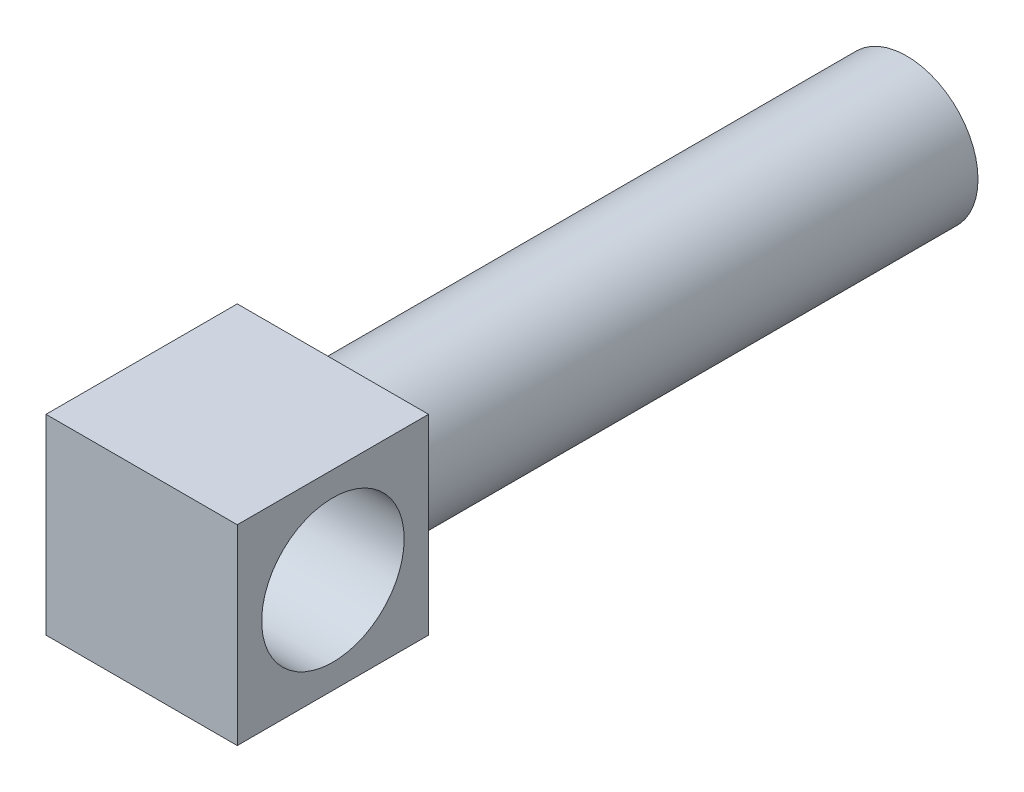
ISO-10303-21;
HEADER;
FILE_DESCRIPTION(('STEP AP214'),'2;1');
FILE_NAME('part.step','',(''),(''),'','','');
FILE_SCHEMA(('AUTOMOTIVE_DESIGN { 1 0 10303 214 1 1 1 1 }'));
ENDSEC;
DATA;
#1=APPLICATION_CONTEXT('core data for automotive mechanical design processes');
#2=APPLICATION_PROTOCOL_DEFINITION('international standard','automotive_design',2000,#1);
#3=PRODUCT_CONTEXT('',#1,'mechanical');
#4=PRODUCT('Part','Part','',(#3));
#5=PRODUCT_RELATED_PRODUCT_CATEGORY('part','',(#4));
#6=PRODUCT_DEFINITION_FORMATION('','',#4);
#7=PRODUCT_DEFINITION_CONTEXT('part definition',#1,'design');
#8=PRODUCT_DEFINITION('design','',#6,#7);
#9=PRODUCT_DEFINITION_SHAPE('','',#8);
#10=(LENGTH_UNIT() NAMED_UNIT(*) SI_UNIT(.MILLI.,.METRE.));
#11=(NAMED_UNIT(*) PLANE_ANGLE_UNIT() SI_UNIT($,.RADIAN.));
#12=(NAMED_UNIT(*) SI_UNIT($,.STERADIAN.) SOLID_ANGLE_UNIT());
#13=UNCERTAINTY_MEASURE_WITH_UNIT(LENGTH_MEASURE(1.E-05),#10,'distance_accuracy_value','');
#14=(GEOMETRIC_REPRESENTATION_CONTEXT(3) GLOBAL_UNCERTAINTY_ASSIGNED_CONTEXT((#13)) GLOBAL_UNIT_ASSIGNED_CONTEXT((#10,
#11,#12)) REPRESENTATION_CONTEXT('',''));
#15=CARTESIAN_POINT('',(0.,0.,0.));
#16=DIRECTION('',(0.,0.,1.));
#17=DIRECTION('',(1.,0.,0.));
#18=AXIS2_PLACEMENT_3D('',#15,#16,#17);
#19=CARTESIAN_POINT('',(18.9979491049441,14.0340762013768,60.));
#20=DIRECTION('',(0.,0.,-1.));
#21=DIRECTION('',(-1.,0.,0.));
#22=AXIS2_PLACEMENT_3D('',#19,#20,#21);
#23=CYLINDRICAL_SURFACE('',#22,7.45);
#24=CARTESIAN_POINT('',(18.9979491049441,14.0340762013768,60.));
#25=DIRECTION('',(0.,0.,1.));
#26=DIRECTION('',(1.,0.,0.));
#27=AXIS2_PLACEMENT_3D('',#24,#25,#26);
#28=CIRCLE('',#27,7.45);
#29=CARTESIAN_POINT('',(26.4479491049441,14.0340762013768,60.));
#30=VERTEX_POINT('',#29);
#31=EDGE_CURVE('E11',#30,#30,#28,.T.);
#32=ORIENTED_EDGE('',*,*,#31,.F.);
#33=EDGE_LOOP('',(#32));
#34=FACE_BOUND('',#33,.T.);
#35=CARTESIAN_POINT('',(18.9979491049441,14.0340762013768,0.));
#36=DIRECTION('',(0.,0.,1.));
#37=DIRECTION('',(1.,0.,0.));
#38=AXIS2_PLACEMENT_3D('',#35,#36,#37);
#39=CIRCLE('',#38,7.45);
#40=CARTESIAN_POINT('',(26.4479491049441,14.0340762013768,0.));
#41=VERTEX_POINT('',#40);
#42=EDGE_CURVE('E42',#41,#41,#39,.T.);
#43=ORIENTED_EDGE('',*,*,#42,.T.);
#44=EDGE_LOOP('',(#43));
#45=FACE_BOUND('',#44,.T.);
#46=ADVANCED_FACE('F39',(#34,#45),#23,.T.);
#47=CARTESIAN_POINT('',(18.9979491049441,14.0340762013768,0.));
#48=DIRECTION('',(0.,0.,1.));
#49=DIRECTION('',(1.,0.,0.));
#50=AXIS2_PLACEMENT_3D('',#47,#48,#49);
#51=PLANE('',#50);
#52=ORIENTED_EDGE('',*,*,#42,.F.);
#53=EDGE_LOOP('',(#52));
#54=FACE_BOUND('',#53,.T.);
#55=ADVANCED_FACE('F119',(#54),#51,.F.);
#56=CARTESIAN_POINT('',(8.99794910494411,24.0340762013768,80.));
#57=DIRECTION('',(1.,0.,0.));
#58=DIRECTION('',(0.,1.,0.));
#59=AXIS2_PLACEMENT_3D('',#56,#57,#58);
#60=PLANE('',#59);
#61=CARTESIAN_POINT('',(8.99794910494411,14.0340762013768,70.));
#62=DIRECTION('',(1.,0.,0.));
#63=DIRECTION('',(0.,0.,-1.));
#64=AXIS2_PLACEMENT_3D('',#61,#62,#63);
#65=CIRCLE('',#64,7.45);
#66=CARTESIAN_POINT('',(8.99794910494411,14.0340762013768,62.55));
#67=VERTEX_POINT('',#66);
#68=EDGE_CURVE('E109',#67,#67,#65,.T.);
#69=ORIENTED_EDGE('',*,*,#68,.T.);
#70=EDGE_LOOP('',(#69));
#71=FACE_BOUND('',#70,.T.);
#72=DIRECTION('',(0.,-1.,0.));
#73=VECTOR('',#72,1.);
#74=CARTESIAN_POINT('',(8.99794910494411,24.0340762013768,60.));
#75=LINE('',#74,#73);
#76=CARTESIAN_POINT('',(8.99794910494411,24.0340762013768,60.));
#77=VERTEX_POINT('',#76);
#78=CARTESIAN_POINT('',(8.99794910494411,4.03407620137677,60.));
#79=VERTEX_POINT('',#78);
#80=EDGE_CURVE('E106',#77,#79,#75,.T.);
#81=ORIENTED_EDGE('',*,*,#80,.T.);
#82=DIRECTION('',(0.,0.,-1.));
#83=VECTOR('',#82,1.);
#84=CARTESIAN_POINT('',(8.99794910494411,4.03407620137677,80.));
#85=LINE('',#84,#83);
#86=CARTESIAN_POINT('',(8.99794910494411,4.03407620137677,80.));
#87=VERTEX_POINT('',#86);
#88=EDGE_CURVE('E97',#87,#79,#85,.T.);
#89=ORIENTED_EDGE('',*,*,#88,.F.);
#90=DIRECTION('',(0.,-1.,0.));
#91=VECTOR('',#90,1.);
#92=CARTESIAN_POINT('',(8.99794910494411,24.0340762013768,80.));
#93=LINE('',#92,#91);
#94=CARTESIAN_POINT('',(8.99794910494411,24.0340762013768,80.));
#95=VERTEX_POINT('',#94);
#96=EDGE_CURVE('E91',#95,#87,#93,.T.);
#97=ORIENTED_EDGE('',*,*,#96,.F.);
#98=DIRECTION('',(0.,0.,-1.));
#99=VECTOR('',#98,1.);
#100=CARTESIAN_POINT('',(8.99794910494411,24.0340762013768,80.));
#101=LINE('',#100,#99);
#102=EDGE_CURVE('E102',#95,#77,#101,.T.);
#103=ORIENTED_EDGE('',*,*,#102,.T.);
#104=EDGE_LOOP('',(#81,#89,#97,#103));
#105=FACE_BOUND('',#104,.T.);
#106=ADVANCED_FACE('F121',(#71,#105),#60,.F.);
#107=CARTESIAN_POINT('',(8.99794910494411,4.03407620137677,80.));
#108=DIRECTION('',(0.,1.,0.));
#109=DIRECTION('',(-1.,0.,0.));
#110=AXIS2_PLACEMENT_3D('',#107,#108,#109);
#111=PLANE('',#110);
#112=DIRECTION('',(1.,0.,0.));
#113=VECTOR('',#112,1.);
#114=CARTESIAN_POINT('',(8.99794910494411,4.03407620137677,60.));
#115=LINE('',#114,#113);
#116=CARTESIAN_POINT('',(28.9979491049441,4.03407620137677,60.));
#117=VERTEX_POINT('',#116);
#118=EDGE_CURVE('E96',#79,#117,#115,.T.);
#119=ORIENTED_EDGE('',*,*,#118,.T.);
#120=DIRECTION('',(0.,0.,-1.));
#121=VECTOR('',#120,1.);
#122=CARTESIAN_POINT('',(28.9979491049441,4.03407620137677,80.));
#123=LINE('',#122,#121);
#124=CARTESIAN_POINT('',(28.9979491049441,4.03407620137677,80.));
#125=VERTEX_POINT('',#124);
#126=EDGE_CURVE('E94',#125,#117,#123,.T.);
#127=ORIENTED_EDGE('',*,*,#126,.F.);
#128=DIRECTION('',(1.,0.,0.));
#129=VECTOR('',#128,1.);
#130=CARTESIAN_POINT('',(8.99794910494411,4.03407620137677,80.));
#131=LINE('',#130,#129);
#132=EDGE_CURVE('E86',#87,#125,#131,.T.);
#133=ORIENTED_EDGE('',*,*,#132,.F.);
#134=ORIENTED_EDGE('',*,*,#88,.T.);
#135=EDGE_LOOP('',(#119,#127,#133,#134));
#136=FACE_BOUND('',#135,.T.);
#137=ADVANCED_FACE('F95',(#136),#111,.F.);
#138=CARTESIAN_POINT('',(28.9979491049441,24.0340762013768,80.));
#139=DIRECTION('',(-1.,0.,0.));
#140=DIRECTION('',(0.,0.,1.));
#141=AXIS2_PLACEMENT_3D('',#138,#139,#140);
#142=PLANE('',#141);
#143=CARTESIAN_POINT('',(28.9979491049441,14.0340762013768,70.));
#144=DIRECTION('',(1.,0.,0.));
#145=DIRECTION('',(0.,0.,-1.));
#146=AXIS2_PLACEMENT_3D('',#143,#144,#145);
#147=CIRCLE('',#146,7.45);
#148=CARTESIAN_POINT('',(28.9979491049441,14.0340762013768,62.55));
#149=VERTEX_POINT('',#148);
#150=EDGE_CURVE('E154',#149,#149,#147,.T.);
#151=ORIENTED_EDGE('',*,*,#150,.F.);
#152=EDGE_LOOP('',(#151));
#153=FACE_BOUND('',#152,.T.);
#154=DIRECTION('',(0.,1.,0.));
#155=VECTOR('',#154,1.);
#156=CARTESIAN_POINT('',(28.9979491049441,24.0340762013768,60.));
#157=LINE('',#156,#155);
#158=CARTESIAN_POINT('',(28.9979491049441,24.0340762013768,60.));
#159=VERTEX_POINT('',#158);
#160=EDGE_CURVE('E72',#117,#159,#157,.T.);
#161=ORIENTED_EDGE('',*,*,#160,.T.);
#162=DIRECTION('',(0.,0.,-1.));
#163=VECTOR('',#162,1.);
#164=CARTESIAN_POINT('',(28.9979491049441,24.0340762013768,80.));
#165=LINE('',#164,#163);
#166=CARTESIAN_POINT('',(28.9979491049441,24.0340762013768,80.));
#167=VERTEX_POINT('',#166);
#168=EDGE_CURVE('E98',#167,#159,#165,.T.);
#169=ORIENTED_EDGE('',*,*,#168,.F.);
#170=DIRECTION('',(0.,1.,0.));
#171=VECTOR('',#170,1.);
#172=CARTESIAN_POINT('',(28.9979491049441,24.0340762013768,80.));
#173=LINE('',#172,#171);
#174=EDGE_CURVE('E89',#125,#167,#173,.T.);
#175=ORIENTED_EDGE('',*,*,#174,.F.);
#176=ORIENTED_EDGE('',*,*,#126,.T.);
#177=EDGE_LOOP('',(#161,#169,#175,#176));
#178=FACE_BOUND('',#177,.T.);
#179=ADVANCED_FACE('F100',(#153,#178),#142,.F.);
#180=CARTESIAN_POINT('',(8.99794910494411,24.0340762013768,80.));
#181=DIRECTION('',(0.,-1.,0.));
#182=DIRECTION('',(1.,0.,0.));
#183=AXIS2_PLACEMENT_3D('',#180,#181,#182);
#184=PLANE('',#183);
#185=DIRECTION('',(-1.,0.,0.));
#186=VECTOR('',#185,1.);
#187=CARTESIAN_POINT('',(8.99794910494411,24.0340762013768,60.));
#188=LINE('',#187,#186);
#189=EDGE_CURVE('E78',#159,#77,#188,.T.);
#190=ORIENTED_EDGE('',*,*,#189,.T.);
#191=ORIENTED_EDGE('',*,*,#102,.F.);
#192=DIRECTION('',(-1.,0.,0.));
#193=VECTOR('',#192,1.);
#194=CARTESIAN_POINT('',(8.99794910494411,24.0340762013768,80.));
#195=LINE('',#194,#193);
#196=EDGE_CURVE('E55',#167,#95,#195,.T.);
#197=ORIENTED_EDGE('',*,*,#196,.F.);
#198=ORIENTED_EDGE('',*,*,#168,.T.);
#199=EDGE_LOOP('',(#190,#191,#197,#198));
#200=FACE_BOUND('',#199,.T.);
#201=ADVANCED_FACE('F134',(#200),#184,.F.);
#202=CARTESIAN_POINT('',(0.,0.,80.));
#203=DIRECTION('',(0.,0.,1.));
#204=DIRECTION('',(1.,0.,0.));
#205=AXIS2_PLACEMENT_3D('',#202,#203,#204);
#206=PLANE('',#205);
#207=ORIENTED_EDGE('',*,*,#96,.T.);
#208=ORIENTED_EDGE('',*,*,#132,.T.);
#209=ORIENTED_EDGE('',*,*,#174,.T.);
#210=ORIENTED_EDGE('',*,*,#196,.T.);
#211=EDGE_LOOP('',(#207,#208,#209,#210));
#212=FACE_BOUND('',#211,.T.);
#213=ADVANCED_FACE('F87',(#212),#206,.T.);
#214=CARTESIAN_POINT('',(0.,0.,60.));
#215=DIRECTION('',(0.,0.,1.));
#216=DIRECTION('',(1.,0.,0.));
#217=AXIS2_PLACEMENT_3D('',#214,#215,#216);
#218=PLANE('',#217);
#219=ORIENTED_EDGE('',*,*,#31,.T.);
#220=EDGE_LOOP('',(#219));
#221=FACE_BOUND('',#220,.T.);
#222=ORIENTED_EDGE('',*,*,#80,.F.);
#223=ORIENTED_EDGE('',*,*,#189,.F.);
#224=ORIENTED_EDGE('',*,*,#160,.F.);
#225=ORIENTED_EDGE('',*,*,#118,.F.);
#226=EDGE_LOOP('',(#222,#223,#224,#225));
#227=FACE_BOUND('',#226,.T.);
#228=ADVANCED_FACE('F138',(#221,#227),#218,.F.);
#229=CARTESIAN_POINT('',(8.99794910494411,14.0340762013768,70.));
#230=DIRECTION('',(1.,0.,0.));
#231=DIRECTION('',(0.,0.,-1.));
#232=AXIS2_PLACEMENT_3D('',#229,#230,#231);
#233=CYLINDRICAL_SURFACE('',#232,7.45);
#234=ORIENTED_EDGE('',*,*,#68,.F.);
#235=EDGE_LOOP('',(#234));
#236=FACE_BOUND('',#235,.T.);
#237=ORIENTED_EDGE('',*,*,#150,.T.);
#238=EDGE_LOOP('',(#237));
#239=FACE_BOUND('',#238,.T.);
#240=ADVANCED_FACE('F141',(#236,#239),#233,.F.);
#241=CLOSED_SHELL('',(#46,#55,#106,#137,#179,#201,#213,#228,#240));
#242=MANIFOLD_SOLID_BREP('B2',#241);
#243=ADVANCED_BREP_SHAPE_REPRESENTATION('',(#18,#242),#14);
#244=SHAPE_DEFINITION_REPRESENTATION(#9,#243);
ENDSEC;
END-ISO-10303-21;
